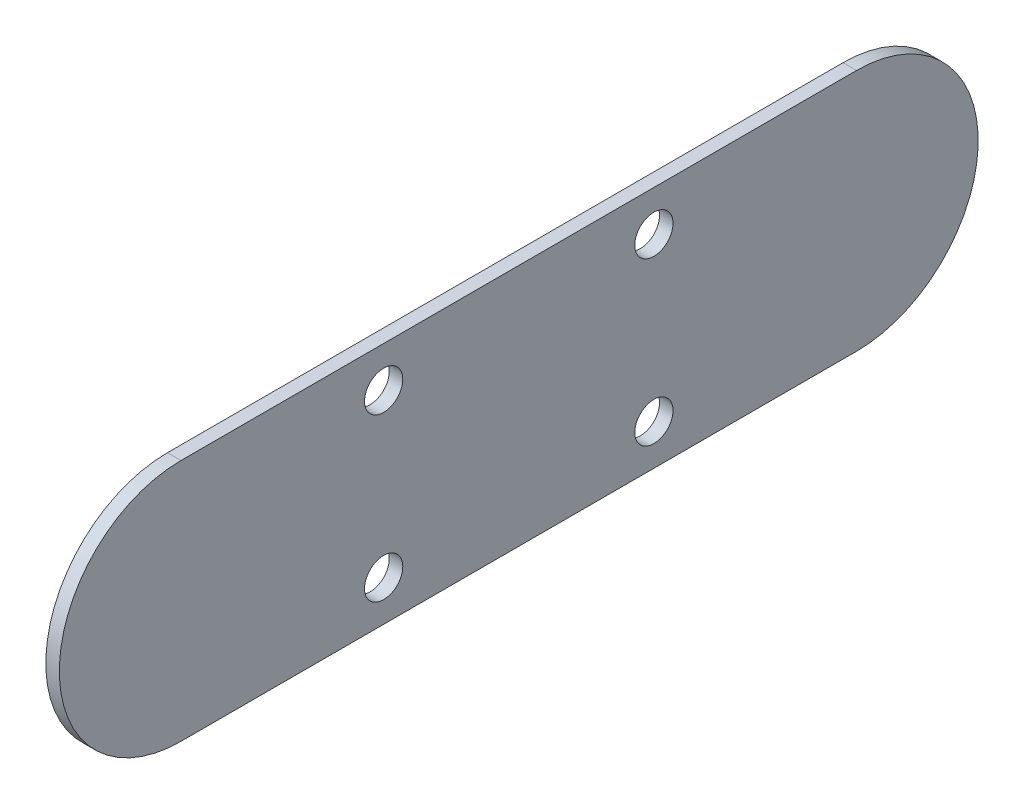
ISO-10303-21;
HEADER;
FILE_DESCRIPTION(('STEP AP214'),'2;1');
FILE_NAME('part.step','',(''),(''),'','','');
FILE_SCHEMA(('AUTOMOTIVE_DESIGN { 1 0 10303 214 1 1 1 1 }'));
ENDSEC;
DATA;
#1=APPLICATION_CONTEXT('core data for automotive mechanical design processes');
#2=APPLICATION_PROTOCOL_DEFINITION('international standard','automotive_design',2000,#1);
#3=PRODUCT_CONTEXT('',#1,'mechanical');
#4=PRODUCT('Part','Part','',(#3));
#5=PRODUCT_RELATED_PRODUCT_CATEGORY('part','',(#4));
#6=PRODUCT_DEFINITION_FORMATION('','',#4);
#7=PRODUCT_DEFINITION_CONTEXT('part definition',#1,'design');
#8=PRODUCT_DEFINITION('design','',#6,#7);
#9=PRODUCT_DEFINITION_SHAPE('','',#8);
#10=(LENGTH_UNIT() NAMED_UNIT(*) SI_UNIT(.MILLI.,.METRE.));
#11=(NAMED_UNIT(*) PLANE_ANGLE_UNIT() SI_UNIT($,.RADIAN.));
#12=(NAMED_UNIT(*) SI_UNIT($,.STERADIAN.) SOLID_ANGLE_UNIT());
#13=UNCERTAINTY_MEASURE_WITH_UNIT(LENGTH_MEASURE(1.E-05),#10,'distance_accuracy_value','');
#14=(GEOMETRIC_REPRESENTATION_CONTEXT(3) GLOBAL_UNCERTAINTY_ASSIGNED_CONTEXT((#13)) GLOBAL_UNIT_ASSIGNED_CONTEXT((#10,
#11,#12)) REPRESENTATION_CONTEXT('',''));
#15=CARTESIAN_POINT('',(0.,0.,0.));
#16=DIRECTION('',(0.,0.,1.));
#17=DIRECTION('',(1.,0.,0.));
#18=AXIS2_PLACEMENT_3D('',#15,#16,#17);
#19=CARTESIAN_POINT('',(1.5875,0.,-39.6875));
#20=DIRECTION('',(-1.,0.,0.));
#21=DIRECTION('',(0.,0.,1.));
#22=AXIS2_PLACEMENT_3D('',#19,#20,#21);
#23=CYLINDRICAL_SURFACE('',#22,14.2875);
#24=CARTESIAN_POINT('',(0.,0.,-39.6875));
#25=DIRECTION('',(1.,0.,0.));
#26=DIRECTION('',(0.,0.,-1.));
#27=AXIS2_PLACEMENT_3D('',#24,#25,#26);
#28=CIRCLE('',#27,14.2875);
#29=CARTESIAN_POINT('',(0.,-14.2875,-39.6875));
#30=VERTEX_POINT('',#29);
#31=CARTESIAN_POINT('',(0.,14.2875,-39.6875));
#32=VERTEX_POINT('',#31);
#33=EDGE_CURVE('E95',#30,#32,#28,.T.);
#34=ORIENTED_EDGE('',*,*,#33,.T.);
#35=DIRECTION('',(-1.,0.,0.));
#36=VECTOR('',#35,1.);
#37=CARTESIAN_POINT('',(1.5875,14.2875,-39.6875));
#38=LINE('',#37,#36);
#39=CARTESIAN_POINT('',(1.5875,14.2875,-39.6875));
#40=VERTEX_POINT('',#39);
#41=EDGE_CURVE('E11',#40,#32,#38,.T.);
#42=ORIENTED_EDGE('',*,*,#41,.F.);
#43=CARTESIAN_POINT('',(1.5875,0.,-39.6875));
#44=DIRECTION('',(1.,0.,0.));
#45=DIRECTION('',(0.,0.,-1.));
#46=AXIS2_PLACEMENT_3D('',#43,#44,#45);
#47=CIRCLE('',#46,14.2875);
#48=CARTESIAN_POINT('',(1.5875,-14.2875,-39.6875));
#49=VERTEX_POINT('',#48);
#50=EDGE_CURVE('E83',#49,#40,#47,.T.);
#51=ORIENTED_EDGE('',*,*,#50,.F.);
#52=DIRECTION('',(-1.,0.,0.));
#53=VECTOR('',#52,1.);
#54=CARTESIAN_POINT('',(1.5875,-14.2875,-39.6875));
#55=LINE('',#54,#53);
#56=EDGE_CURVE('E91',#49,#30,#55,.T.);
#57=ORIENTED_EDGE('',*,*,#56,.T.);
#58=EDGE_LOOP('',(#34,#42,#51,#57));
#59=FACE_BOUND('',#58,.T.);
#60=ADVANCED_FACE('F32',(#59),#23,.T.);
#61=CARTESIAN_POINT('',(1.5875,14.2875,-39.6875));
#62=DIRECTION('',(0.,-1.,0.));
#63=DIRECTION('',(0.,0.,-1.));
#64=AXIS2_PLACEMENT_3D('',#61,#62,#63);
#65=PLANE('',#64);
#66=DIRECTION('',(0.,0.,1.));
#67=VECTOR('',#66,1.);
#68=CARTESIAN_POINT('',(0.,14.2875,-39.6875));
#69=LINE('',#68,#67);
#70=CARTESIAN_POINT('',(0.,14.2875,39.6875));
#71=VERTEX_POINT('',#70);
#72=EDGE_CURVE('E87',#32,#71,#69,.T.);
#73=ORIENTED_EDGE('',*,*,#72,.T.);
#74=DIRECTION('',(-1.,0.,0.));
#75=VECTOR('',#74,1.);
#76=CARTESIAN_POINT('',(1.5875,14.2875,39.6875));
#77=LINE('',#76,#75);
#78=CARTESIAN_POINT('',(1.5875,14.2875,39.6875));
#79=VERTEX_POINT('',#78);
#80=EDGE_CURVE('E40',#79,#71,#77,.T.);
#81=ORIENTED_EDGE('',*,*,#80,.F.);
#82=DIRECTION('',(0.,0.,1.));
#83=VECTOR('',#82,1.);
#84=CARTESIAN_POINT('',(1.5875,14.2875,-39.6875));
#85=LINE('',#84,#83);
#86=EDGE_CURVE('E78',#40,#79,#85,.T.);
#87=ORIENTED_EDGE('',*,*,#86,.F.);
#88=ORIENTED_EDGE('',*,*,#41,.T.);
#89=EDGE_LOOP('',(#73,#81,#87,#88));
#90=FACE_BOUND('',#89,.T.);
#91=ADVANCED_FACE('F86',(#90),#65,.F.);
#92=CARTESIAN_POINT('',(1.5875,0.,39.6875));
#93=DIRECTION('',(-1.,0.,0.));
#94=DIRECTION('',(0.,0.,1.));
#95=AXIS2_PLACEMENT_3D('',#92,#93,#94);
#96=CYLINDRICAL_SURFACE('',#95,14.2875);
#97=CARTESIAN_POINT('',(0.,0.,39.6875));
#98=DIRECTION('',(1.,0.,0.));
#99=DIRECTION('',(0.,0.,-1.));
#100=AXIS2_PLACEMENT_3D('',#97,#98,#99);
#101=CIRCLE('',#100,14.2875);
#102=CARTESIAN_POINT('',(0.,-14.2875,39.6875));
#103=VERTEX_POINT('',#102);
#104=EDGE_CURVE('E65',#71,#103,#101,.T.);
#105=ORIENTED_EDGE('',*,*,#104,.T.);
#106=DIRECTION('',(-1.,0.,0.));
#107=VECTOR('',#106,1.);
#108=CARTESIAN_POINT('',(1.5875,-14.2875,39.6875));
#109=LINE('',#108,#107);
#110=CARTESIAN_POINT('',(1.5875,-14.2875,39.6875));
#111=VERTEX_POINT('',#110);
#112=EDGE_CURVE('E88',#111,#103,#109,.T.);
#113=ORIENTED_EDGE('',*,*,#112,.F.);
#114=CARTESIAN_POINT('',(1.5875,0.,39.6875));
#115=DIRECTION('',(1.,0.,0.));
#116=DIRECTION('',(0.,0.,-1.));
#117=AXIS2_PLACEMENT_3D('',#114,#115,#116);
#118=CIRCLE('',#117,14.2875);
#119=EDGE_CURVE('E81',#79,#111,#118,.T.);
#120=ORIENTED_EDGE('',*,*,#119,.F.);
#121=ORIENTED_EDGE('',*,*,#80,.T.);
#122=EDGE_LOOP('',(#105,#113,#120,#121));
#123=FACE_BOUND('',#122,.T.);
#124=ADVANCED_FACE('F89',(#123),#96,.T.);
#125=CARTESIAN_POINT('',(1.5875,-14.2875,-39.6875));
#126=DIRECTION('',(0.,1.,0.));
#127=DIRECTION('',(0.,0.,1.));
#128=AXIS2_PLACEMENT_3D('',#125,#126,#127);
#129=PLANE('',#128);
#130=DIRECTION('',(0.,0.,-1.));
#131=VECTOR('',#130,1.);
#132=CARTESIAN_POINT('',(0.,-14.2875,-39.6875));
#133=LINE('',#132,#131);
#134=EDGE_CURVE('E71',#103,#30,#133,.T.);
#135=ORIENTED_EDGE('',*,*,#134,.T.);
#136=ORIENTED_EDGE('',*,*,#56,.F.);
#137=DIRECTION('',(0.,0.,-1.));
#138=VECTOR('',#137,1.);
#139=CARTESIAN_POINT('',(1.5875,-14.2875,-39.6875));
#140=LINE('',#139,#138);
#141=EDGE_CURVE('E48',#111,#49,#140,.T.);
#142=ORIENTED_EDGE('',*,*,#141,.F.);
#143=ORIENTED_EDGE('',*,*,#112,.T.);
#144=EDGE_LOOP('',(#135,#136,#142,#143));
#145=FACE_BOUND('',#144,.T.);
#146=ADVANCED_FACE('F103',(#145),#129,.F.);
#147=CARTESIAN_POINT('',(1.5875,0.,-39.6875));
#148=DIRECTION('',(1.,0.,0.));
#149=DIRECTION('',(0.,0.,-1.));
#150=AXIS2_PLACEMENT_3D('',#147,#148,#149);
#151=PLANE('',#150);
#152=CARTESIAN_POINT('',(1.5875,9.525,15.875));
#153=DIRECTION('',(1.,0.,0.));
#154=DIRECTION('',(0.,0.,-1.));
#155=AXIS2_PLACEMENT_3D('',#152,#153,#154);
#156=CIRCLE('',#155,2.24789999999999);
#157=CARTESIAN_POINT('',(1.5875,9.525,13.6271));
#158=VERTEX_POINT('',#157);
#159=EDGE_CURVE('E129',#158,#158,#156,.T.);
#160=ORIENTED_EDGE('',*,*,#159,.F.);
#161=EDGE_LOOP('',(#160));
#162=FACE_BOUND('',#161,.T.);
#163=CARTESIAN_POINT('',(1.5875,-9.52500000000001,15.875));
#164=DIRECTION('',(1.,0.,0.));
#165=DIRECTION('',(0.,0.,-1.));
#166=AXIS2_PLACEMENT_3D('',#163,#164,#165);
#167=CIRCLE('',#166,2.24789999999999);
#168=CARTESIAN_POINT('',(1.5875,-9.52500000000001,13.6271));
#169=VERTEX_POINT('',#168);
#170=EDGE_CURVE('E123',#169,#169,#167,.T.);
#171=ORIENTED_EDGE('',*,*,#170,.F.);
#172=EDGE_LOOP('',(#171));
#173=FACE_BOUND('',#172,.T.);
#174=CARTESIAN_POINT('',(1.5875,-9.525,-15.875));
#175=DIRECTION('',(1.,0.,0.));
#176=DIRECTION('',(0.,0.,-1.));
#177=AXIS2_PLACEMENT_3D('',#174,#175,#176);
#178=CIRCLE('',#177,2.24789999999999);
#179=CARTESIAN_POINT('',(1.5875,-9.525,-18.1229));
#180=VERTEX_POINT('',#179);
#181=EDGE_CURVE('E117',#180,#180,#178,.T.);
#182=ORIENTED_EDGE('',*,*,#181,.F.);
#183=EDGE_LOOP('',(#182));
#184=FACE_BOUND('',#183,.T.);
#185=CARTESIAN_POINT('',(1.5875,9.525,-15.875));
#186=DIRECTION('',(1.,0.,0.));
#187=DIRECTION('',(0.,0.,-1.));
#188=AXIS2_PLACEMENT_3D('',#185,#186,#187);
#189=CIRCLE('',#188,2.24789999999999);
#190=CARTESIAN_POINT('',(1.5875,9.525,-18.1229));
#191=VERTEX_POINT('',#190);
#192=EDGE_CURVE('E111',#191,#191,#189,.T.);
#193=ORIENTED_EDGE('',*,*,#192,.F.);
#194=EDGE_LOOP('',(#193));
#195=FACE_BOUND('',#194,.T.);
#196=ORIENTED_EDGE('',*,*,#50,.T.);
#197=ORIENTED_EDGE('',*,*,#86,.T.);
#198=ORIENTED_EDGE('',*,*,#119,.T.);
#199=ORIENTED_EDGE('',*,*,#141,.T.);
#200=EDGE_LOOP('',(#196,#197,#198,#199));
#201=FACE_BOUND('',#200,.T.);
#202=ADVANCED_FACE('F79',(#162,#173,#184,#195,#201),#151,.T.);
#203=CARTESIAN_POINT('',(0.,0.,-39.6875));
#204=DIRECTION('',(1.,0.,0.));
#205=DIRECTION('',(0.,0.,-1.));
#206=AXIS2_PLACEMENT_3D('',#203,#204,#205);
#207=PLANE('',#206);
#208=CARTESIAN_POINT('',(0.,9.525,15.875));
#209=DIRECTION('',(1.,0.,0.));
#210=DIRECTION('',(0.,0.,-1.));
#211=AXIS2_PLACEMENT_3D('',#208,#209,#210);
#212=CIRCLE('',#211,2.24789999999999);
#213=CARTESIAN_POINT('',(0.,9.525,13.6271));
#214=VERTEX_POINT('',#213);
#215=EDGE_CURVE('E126',#214,#214,#212,.T.);
#216=ORIENTED_EDGE('',*,*,#215,.T.);
#217=EDGE_LOOP('',(#216));
#218=FACE_BOUND('',#217,.T.);
#219=CARTESIAN_POINT('',(0.,-9.52500000000001,15.875));
#220=DIRECTION('',(1.,0.,0.));
#221=DIRECTION('',(0.,0.,-1.));
#222=AXIS2_PLACEMENT_3D('',#219,#220,#221);
#223=CIRCLE('',#222,2.24789999999999);
#224=CARTESIAN_POINT('',(0.,-9.52500000000001,13.6271));
#225=VERTEX_POINT('',#224);
#226=EDGE_CURVE('E120',#225,#225,#223,.T.);
#227=ORIENTED_EDGE('',*,*,#226,.T.);
#228=EDGE_LOOP('',(#227));
#229=FACE_BOUND('',#228,.T.);
#230=CARTESIAN_POINT('',(0.,-9.525,-15.875));
#231=DIRECTION('',(1.,0.,0.));
#232=DIRECTION('',(0.,0.,-1.));
#233=AXIS2_PLACEMENT_3D('',#230,#231,#232);
#234=CIRCLE('',#233,2.24789999999999);
#235=CARTESIAN_POINT('',(0.,-9.525,-18.1229));
#236=VERTEX_POINT('',#235);
#237=EDGE_CURVE('E114',#236,#236,#234,.T.);
#238=ORIENTED_EDGE('',*,*,#237,.T.);
#239=EDGE_LOOP('',(#238));
#240=FACE_BOUND('',#239,.T.);
#241=CARTESIAN_POINT('',(0.,9.525,-15.875));
#242=DIRECTION('',(1.,0.,0.));
#243=DIRECTION('',(0.,0.,-1.));
#244=AXIS2_PLACEMENT_3D('',#241,#242,#243);
#245=CIRCLE('',#244,2.24789999999999);
#246=CARTESIAN_POINT('',(0.,9.525,-18.1229));
#247=VERTEX_POINT('',#246);
#248=EDGE_CURVE('E98',#247,#247,#245,.T.);
#249=ORIENTED_EDGE('',*,*,#248,.T.);
#250=EDGE_LOOP('',(#249));
#251=FACE_BOUND('',#250,.T.);
#252=ORIENTED_EDGE('',*,*,#33,.F.);
#253=ORIENTED_EDGE('',*,*,#134,.F.);
#254=ORIENTED_EDGE('',*,*,#104,.F.);
#255=ORIENTED_EDGE('',*,*,#72,.F.);
#256=EDGE_LOOP('',(#252,#253,#254,#255));
#257=FACE_BOUND('',#256,.T.);
#258=ADVANCED_FACE('F106',(#218,#229,#240,#251,#257),#207,.F.);
#259=CARTESIAN_POINT('',(1.5875,9.525,-15.875));
#260=DIRECTION('',(1.,0.,0.));
#261=DIRECTION('',(0.,0.,-1.));
#262=AXIS2_PLACEMENT_3D('',#259,#260,#261);
#263=CYLINDRICAL_SURFACE('',#262,2.24789999999999);
#264=ORIENTED_EDGE('',*,*,#248,.F.);
#265=EDGE_LOOP('',(#264));
#266=FACE_BOUND('',#265,.T.);
#267=ORIENTED_EDGE('',*,*,#192,.T.);
#268=EDGE_LOOP('',(#267));
#269=FACE_BOUND('',#268,.T.);
#270=ADVANCED_FACE('F144',(#266,#269),#263,.F.);
#271=CARTESIAN_POINT('',(1.5875,-9.525,-15.875));
#272=DIRECTION('',(1.,0.,0.));
#273=DIRECTION('',(0.,0.,-1.));
#274=AXIS2_PLACEMENT_3D('',#271,#272,#273);
#275=CYLINDRICAL_SURFACE('',#274,2.24789999999999);
#276=ORIENTED_EDGE('',*,*,#237,.F.);
#277=EDGE_LOOP('',(#276));
#278=FACE_BOUND('',#277,.T.);
#279=ORIENTED_EDGE('',*,*,#181,.T.);
#280=EDGE_LOOP('',(#279));
#281=FACE_BOUND('',#280,.T.);
#282=ADVANCED_FACE('F146',(#278,#281),#275,.F.);
#283=CARTESIAN_POINT('',(1.5875,-9.52500000000001,15.875));
#284=DIRECTION('',(1.,0.,0.));
#285=DIRECTION('',(0.,0.,-1.));
#286=AXIS2_PLACEMENT_3D('',#283,#284,#285);
#287=CYLINDRICAL_SURFACE('',#286,2.24789999999999);
#288=ORIENTED_EDGE('',*,*,#226,.F.);
#289=EDGE_LOOP('',(#288));
#290=FACE_BOUND('',#289,.T.);
#291=ORIENTED_EDGE('',*,*,#170,.T.);
#292=EDGE_LOOP('',(#291));
#293=FACE_BOUND('',#292,.T.);
#294=ADVANCED_FACE('F153',(#290,#293),#287,.F.);
#295=CARTESIAN_POINT('',(1.5875,9.525,15.875));
#296=DIRECTION('',(1.,0.,0.));
#297=DIRECTION('',(0.,0.,-1.));
#298=AXIS2_PLACEMENT_3D('',#295,#296,#297);
#299=CYLINDRICAL_SURFACE('',#298,2.24789999999999);
#300=ORIENTED_EDGE('',*,*,#215,.F.);
#301=EDGE_LOOP('',(#300));
#302=FACE_BOUND('',#301,.T.);
#303=ORIENTED_EDGE('',*,*,#159,.T.);
#304=EDGE_LOOP('',(#303));
#305=FACE_BOUND('',#304,.T.);
#306=ADVANCED_FACE('F133',(#302,#305),#299,.F.);
#307=CLOSED_SHELL('',(#60,#91,#124,#146,#202,#258,#270,#282,#294,#306));
#308=MANIFOLD_SOLID_BREP('B2',#307);
#309=ADVANCED_BREP_SHAPE_REPRESENTATION('',(#18,#308),#14);
#310=SHAPE_DEFINITION_REPRESENTATION(#9,#309);
ENDSEC;
END-ISO-10303-21;
